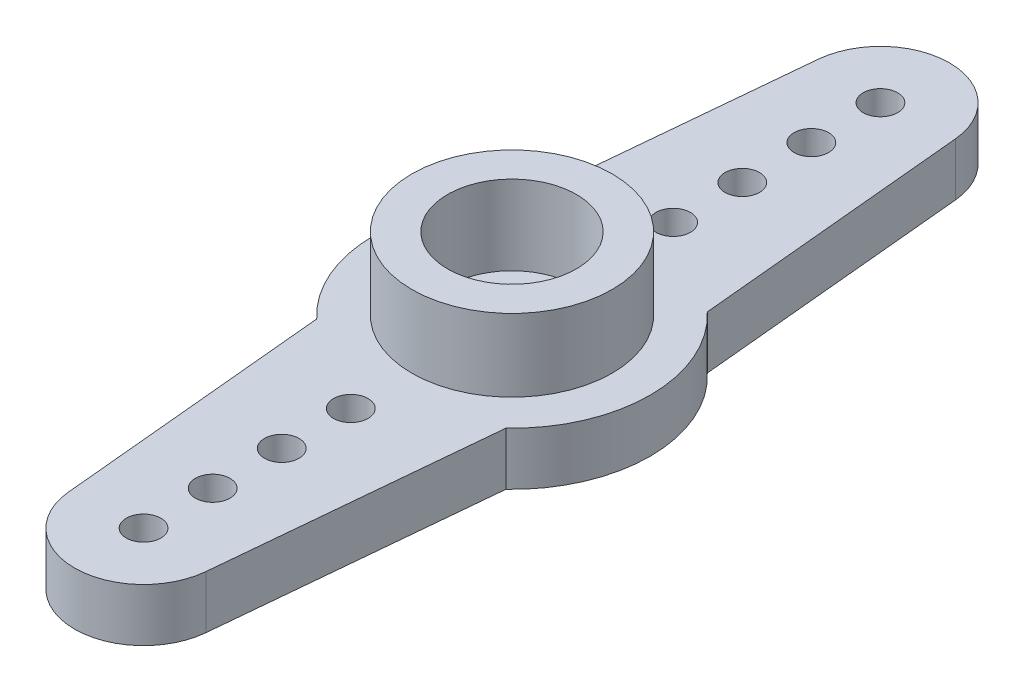
ISO-10303-21;
HEADER;
FILE_DESCRIPTION(('STEP AP214'),'2;1');
FILE_NAME('part.step','',(''),(''),'','','');
FILE_SCHEMA(('AUTOMOTIVE_DESIGN { 1 0 10303 214 1 1 1 1 }'));
ENDSEC;
DATA;
#1=APPLICATION_CONTEXT('core data for automotive mechanical design processes');
#2=APPLICATION_PROTOCOL_DEFINITION('international standard','automotive_design',2000,#1);
#3=PRODUCT_CONTEXT('',#1,'mechanical');
#4=PRODUCT('Part','Part','',(#3));
#5=PRODUCT_RELATED_PRODUCT_CATEGORY('part','',(#4));
#6=PRODUCT_DEFINITION_FORMATION('','',#4);
#7=PRODUCT_DEFINITION_CONTEXT('part definition',#1,'design');
#8=PRODUCT_DEFINITION('design','',#6,#7);
#9=PRODUCT_DEFINITION_SHAPE('','',#8);
#10=(LENGTH_UNIT() NAMED_UNIT(*) SI_UNIT(.MILLI.,.METRE.));
#11=(NAMED_UNIT(*) PLANE_ANGLE_UNIT() SI_UNIT($,.RADIAN.));
#12=(NAMED_UNIT(*) SI_UNIT($,.STERADIAN.) SOLID_ANGLE_UNIT());
#13=UNCERTAINTY_MEASURE_WITH_UNIT(LENGTH_MEASURE(1.E-05),#10,'distance_accuracy_value','');
#14=(GEOMETRIC_REPRESENTATION_CONTEXT(3) GLOBAL_UNCERTAINTY_ASSIGNED_CONTEXT((#13)) GLOBAL_UNIT_ASSIGNED_CONTEXT((#10,
#11,#12)) REPRESENTATION_CONTEXT('',''));
#15=CARTESIAN_POINT('',(0.,0.,0.));
#16=DIRECTION('',(0.,0.,1.));
#17=DIRECTION('',(1.,0.,0.));
#18=AXIS2_PLACEMENT_3D('',#15,#16,#17);
#19=CARTESIAN_POINT('',(0.,5.451,-13.));
#20=DIRECTION('',(0.,-1.,0.));
#21=DIRECTION('',(0.,0.,-1.));
#22=AXIS2_PLACEMENT_3D('',#19,#20,#21);
#23=CYLINDRICAL_SURFACE('',#22,0.75);
#24=CARTESIAN_POINT('',(0.,2.3,-13.));
#25=DIRECTION('',(0.,1.,0.));
#26=DIRECTION('',(0.,0.,1.));
#27=AXIS2_PLACEMENT_3D('',#24,#25,#26);
#28=CIRCLE('',#27,0.75);
#29=CARTESIAN_POINT('',(0.,2.3,-12.25));
#30=VERTEX_POINT('',#29);
#31=EDGE_CURVE('E176',#30,#30,#28,.T.);
#32=ORIENTED_EDGE('',*,*,#31,.T.);
#33=EDGE_LOOP('',(#32));
#34=FACE_BOUND('',#33,.T.);
#35=CARTESIAN_POINT('',(0.,0.,-13.));
#36=DIRECTION('',(0.,1.,0.));
#37=DIRECTION('',(0.,0.,1.));
#38=AXIS2_PLACEMENT_3D('',#35,#36,#37);
#39=CIRCLE('',#38,0.75);
#40=CARTESIAN_POINT('',(0.,0.,-12.25));
#41=VERTEX_POINT('',#40);
#42=EDGE_CURVE('E47',#41,#41,#39,.T.);
#43=ORIENTED_EDGE('',*,*,#42,.F.);
#44=EDGE_LOOP('',(#43));
#45=FACE_BOUND('',#44,.T.);
#46=ADVANCED_FACE('F39',(#34,#45),#23,.F.);
#47=CARTESIAN_POINT('',(0.,5.45,0.));
#48=DIRECTION('',(0.,1.,0.));
#49=DIRECTION('',(0.,0.,1.));
#50=AXIS2_PLACEMENT_3D('',#47,#48,#49);
#51=PLANE('',#50);
#52=CARTESIAN_POINT('',(0.,5.45,0.));
#53=DIRECTION('',(0.,1.,0.));
#54=DIRECTION('',(0.,0.,1.));
#55=AXIS2_PLACEMENT_3D('',#52,#53,#54);
#56=CIRCLE('',#55,4.35);
#57=CARTESIAN_POINT('',(0.,5.45,4.35));
#58=VERTEX_POINT('',#57);
#59=EDGE_CURVE('E173',#58,#58,#56,.T.);
#60=ORIENTED_EDGE('',*,*,#59,.T.);
#61=EDGE_LOOP('',(#60));
#62=FACE_BOUND('',#61,.T.);
#63=CARTESIAN_POINT('',(0.,5.45,0.));
#64=DIRECTION('',(0.,1.,0.));
#65=DIRECTION('',(0.,0.,1.));
#66=AXIS2_PLACEMENT_3D('',#63,#64,#65);
#67=CIRCLE('',#66,2.8);
#68=CARTESIAN_POINT('',(0.,5.45,2.8));
#69=VERTEX_POINT('',#68);
#70=EDGE_CURVE('E170',#69,#69,#67,.T.);
#71=ORIENTED_EDGE('',*,*,#70,.F.);
#72=EDGE_LOOP('',(#71));
#73=FACE_BOUND('',#72,.T.);
#74=ADVANCED_FACE('F185',(#62,#73),#51,.T.);
#75=CARTESIAN_POINT('',(0.,0.,0.));
#76=DIRECTION('',(0.,1.,0.));
#77=DIRECTION('',(0.,0.,1.));
#78=AXIS2_PLACEMENT_3D('',#75,#76,#77);
#79=PLANE('',#78);
#80=CARTESIAN_POINT('',(0.,0.,7.));
#81=DIRECTION('',(0.,-1.,0.));
#82=DIRECTION('',(0.,0.,-1.));
#83=AXIS2_PLACEMENT_3D('',#80,#81,#82);
#84=CIRCLE('',#83,0.75);
#85=CARTESIAN_POINT('',(0.,0.,6.25));
#86=VERTEX_POINT('',#85);
#87=EDGE_CURVE('E357',#86,#86,#84,.T.);
#88=ORIENTED_EDGE('',*,*,#87,.F.);
#89=EDGE_LOOP('',(#88));
#90=FACE_BOUND('',#89,.T.);
#91=CARTESIAN_POINT('',(0.,0.,10.));
#92=DIRECTION('',(0.,-1.,0.));
#93=DIRECTION('',(0.,0.,-1.));
#94=AXIS2_PLACEMENT_3D('',#91,#92,#93);
#95=CIRCLE('',#94,0.75);
#96=CARTESIAN_POINT('',(0.,0.,9.25));
#97=VERTEX_POINT('',#96);
#98=EDGE_CURVE('E374',#97,#97,#95,.T.);
#99=ORIENTED_EDGE('',*,*,#98,.F.);
#100=EDGE_LOOP('',(#99));
#101=FACE_BOUND('',#100,.T.);
#102=CARTESIAN_POINT('',(0.,0.,13.));
#103=DIRECTION('',(0.,-1.,0.));
#104=DIRECTION('',(0.,0.,-1.));
#105=AXIS2_PLACEMENT_3D('',#102,#103,#104);
#106=CIRCLE('',#105,0.75);
#107=CARTESIAN_POINT('',(0.,0.,12.25));
#108=VERTEX_POINT('',#107);
#109=EDGE_CURVE('E368',#108,#108,#106,.T.);
#110=ORIENTED_EDGE('',*,*,#109,.F.);
#111=EDGE_LOOP('',(#110));
#112=FACE_BOUND('',#111,.T.);
#113=CARTESIAN_POINT('',(0.,0.,16.));
#114=DIRECTION('',(0.,-1.,0.));
#115=DIRECTION('',(0.,0.,-1.));
#116=AXIS2_PLACEMENT_3D('',#113,#114,#115);
#117=CIRCLE('',#116,0.75);
#118=CARTESIAN_POINT('',(0.,0.,15.25));
#119=VERTEX_POINT('',#118);
#120=EDGE_CURVE('E361',#119,#119,#117,.T.);
#121=ORIENTED_EDGE('',*,*,#120,.F.);
#122=EDGE_LOOP('',(#121));
#123=FACE_BOUND('',#122,.T.);
#124=CARTESIAN_POINT('',(0.,0.,-16.));
#125=DIRECTION('',(0.,1.,0.));
#126=DIRECTION('',(0.,0.,1.));
#127=AXIS2_PLACEMENT_3D('',#124,#125,#126);
#128=CIRCLE('',#127,0.75);
#129=CARTESIAN_POINT('',(0.,0.,-15.25));
#130=VERTEX_POINT('',#129);
#131=EDGE_CURVE('E354',#130,#130,#128,.T.);
#132=ORIENTED_EDGE('',*,*,#131,.T.);
#133=EDGE_LOOP('',(#132));
#134=FACE_BOUND('',#133,.T.);
#135=CARTESIAN_POINT('',(0.,0.,-10.));
#136=DIRECTION('',(0.,1.,0.));
#137=DIRECTION('',(0.,0.,1.));
#138=AXIS2_PLACEMENT_3D('',#135,#136,#137);
#139=CIRCLE('',#138,0.75);
#140=CARTESIAN_POINT('',(0.,0.,-9.25));
#141=VERTEX_POINT('',#140);
#142=EDGE_CURVE('E319',#141,#141,#139,.T.);
#143=ORIENTED_EDGE('',*,*,#142,.T.);
#144=EDGE_LOOP('',(#143));
#145=FACE_BOUND('',#144,.T.);
#146=CARTESIAN_POINT('',(0.,0.,-7.));
#147=DIRECTION('',(0.,1.,0.));
#148=DIRECTION('',(0.,0.,1.));
#149=AXIS2_PLACEMENT_3D('',#146,#147,#148);
#150=CIRCLE('',#149,0.75);
#151=CARTESIAN_POINT('',(0.,0.,-6.25));
#152=VERTEX_POINT('',#151);
#153=EDGE_CURVE('E321',#152,#152,#150,.T.);
#154=ORIENTED_EDGE('',*,*,#153,.T.);
#155=EDGE_LOOP('',(#154));
#156=FACE_BOUND('',#155,.T.);
#157=DIRECTION('',(0.09375,0.,-0.995595770129625));
#158=VECTOR('',#157,1.);
#159=CARTESIAN_POINT('',(4.48018096558331,0.,0.421875));
#160=LINE('',#159,#158);
#161=CARTESIAN_POINT('',(2.98678731038887,0.,16.28125));
#162=VERTEX_POINT('',#161);
#163=CARTESIAN_POINT('',(4.10812218746485,0.,4.37302322116622));
#164=VERTEX_POINT('',#163);
#165=EDGE_CURVE('E137',#162,#164,#160,.T.);
#166=ORIENTED_EDGE('',*,*,#165,.F.);
#167=CARTESIAN_POINT('',(0.,0.,16.));
#168=DIRECTION('',(0.,1.,0.));
#169=DIRECTION('',(0.,0.,1.));
#170=AXIS2_PLACEMENT_3D('',#167,#168,#169);
#171=CIRCLE('',#170,3.);
#172=CARTESIAN_POINT('',(-2.98678731038887,0.,16.28125));
#173=VERTEX_POINT('',#172);
#174=EDGE_CURVE('E90',#173,#162,#171,.T.);
#175=ORIENTED_EDGE('',*,*,#174,.F.);
#176=DIRECTION('',(0.09375,0.,0.995595770129625));
#177=VECTOR('',#176,1.);
#178=CARTESIAN_POINT('',(-4.48018096558331,0.,0.421875));
#179=LINE('',#178,#177);
#180=CARTESIAN_POINT('',(-4.10812218746485,0.,4.37302322116622));
#181=VERTEX_POINT('',#180);
#182=EDGE_CURVE('E84',#181,#173,#179,.T.);
#183=ORIENTED_EDGE('',*,*,#182,.F.);
#184=CARTESIAN_POINT('',(0.,0.,0.));
#185=DIRECTION('',(0.,1.,0.));
#186=DIRECTION('',(0.,0.,1.));
#187=AXIS2_PLACEMENT_3D('',#184,#185,#186);
#188=CIRCLE('',#187,6.);
#189=CARTESIAN_POINT('',(-4.10812218746485,0.,-4.37302322116622));
#190=VERTEX_POINT('',#189);
#191=EDGE_CURVE('E127',#190,#181,#188,.T.);
#192=ORIENTED_EDGE('',*,*,#191,.F.);
#193=DIRECTION('',(-0.0937499999999999,0.,0.995595770129625));
#194=VECTOR('',#193,1.);
#195=CARTESIAN_POINT('',(-4.48018096558331,0.,-0.421875));
#196=LINE('',#195,#194);
#197=CARTESIAN_POINT('',(-2.98678731038887,0.,-16.28125));
#198=VERTEX_POINT('',#197);
#199=EDGE_CURVE('E147',#198,#190,#196,.T.);
#200=ORIENTED_EDGE('',*,*,#199,.F.);
#201=CARTESIAN_POINT('',(0.,0.,-16.));
#202=DIRECTION('',(0.,1.,0.));
#203=DIRECTION('',(0.,0.,1.));
#204=AXIS2_PLACEMENT_3D('',#201,#202,#203);
#205=CIRCLE('',#204,3.);
#206=CARTESIAN_POINT('',(2.98678731038888,0.,-16.28125));
#207=VERTEX_POINT('',#206);
#208=EDGE_CURVE('E145',#207,#198,#205,.T.);
#209=ORIENTED_EDGE('',*,*,#208,.F.);
#210=DIRECTION('',(-0.0937499999999999,0.,-0.995595770129625));
#211=VECTOR('',#210,1.);
#212=CARTESIAN_POINT('',(4.48018096558331,0.,-0.421874999999999));
#213=LINE('',#212,#211);
#214=CARTESIAN_POINT('',(4.10812218746485,0.,-4.37302322116622));
#215=VERTEX_POINT('',#214);
#216=EDGE_CURVE('E143',#215,#207,#213,.T.);
#217=ORIENTED_EDGE('',*,*,#216,.F.);
#218=CARTESIAN_POINT('',(0.,0.,0.));
#219=DIRECTION('',(0.,1.,0.));
#220=DIRECTION('',(0.,0.,1.));
#221=AXIS2_PLACEMENT_3D('',#218,#219,#220);
#222=CIRCLE('',#221,6.);
#223=EDGE_CURVE('E140',#164,#215,#222,.T.);
#224=ORIENTED_EDGE('',*,*,#223,.F.);
#225=EDGE_LOOP('',(#166,#175,#183,#192,#200,#209,#217,#224));
#226=FACE_BOUND('',#225,.T.);
#227=ORIENTED_EDGE('',*,*,#42,.T.);
#228=EDGE_LOOP('',(#227));
#229=FACE_BOUND('',#228,.T.);
#230=CARTESIAN_POINT('',(0.,0.,0.));
#231=DIRECTION('',(0.,1.,0.));
#232=DIRECTION('',(0.,0.,1.));
#233=AXIS2_PLACEMENT_3D('',#230,#231,#232);
#234=CIRCLE('',#233,1.5);
#235=CARTESIAN_POINT('',(0.,0.,1.5));
#236=VERTEX_POINT('',#235);
#237=EDGE_CURVE('E381',#236,#236,#234,.T.);
#238=ORIENTED_EDGE('',*,*,#237,.T.);
#239=EDGE_LOOP('',(#238));
#240=FACE_BOUND('',#239,.T.);
#241=ADVANCED_FACE('F181',(#90,#101,#112,#123,#134,#145,#156,#226,#229,#240),#79,.F.);
#242=CARTESIAN_POINT('',(0.,5.45,0.));
#243=DIRECTION('',(0.,-1.,0.));
#244=DIRECTION('',(0.,0.,-1.));
#245=AXIS2_PLACEMENT_3D('',#242,#243,#244);
#246=CYLINDRICAL_SURFACE('',#245,4.35);
#247=CARTESIAN_POINT('',(0.,2.3,0.));
#248=DIRECTION('',(0.,1.,0.));
#249=DIRECTION('',(0.,0.,1.));
#250=AXIS2_PLACEMENT_3D('',#247,#248,#249);
#251=CIRCLE('',#250,4.35);
#252=CARTESIAN_POINT('',(0.,2.3,4.35));
#253=VERTEX_POINT('',#252);
#254=EDGE_CURVE('E167',#253,#253,#251,.T.);
#255=ORIENTED_EDGE('',*,*,#254,.T.);
#256=EDGE_LOOP('',(#255));
#257=FACE_BOUND('',#256,.T.);
#258=ORIENTED_EDGE('',*,*,#59,.F.);
#259=EDGE_LOOP('',(#258));
#260=FACE_BOUND('',#259,.T.);
#261=ADVANCED_FACE('F206',(#257,#260),#246,.T.);
#262=CARTESIAN_POINT('',(0.,5.45,0.));
#263=DIRECTION('',(0.,-1.,0.));
#264=DIRECTION('',(0.,0.,-1.));
#265=AXIS2_PLACEMENT_3D('',#262,#263,#264);
#266=CYLINDRICAL_SURFACE('',#265,2.8);
#267=CARTESIAN_POINT('',(0.,2.,0.));
#268=DIRECTION('',(0.,1.,0.));
#269=DIRECTION('',(0.,0.,1.));
#270=AXIS2_PLACEMENT_3D('',#267,#268,#269);
#271=CIRCLE('',#270,2.8);
#272=CARTESIAN_POINT('',(0.,2.,2.8));
#273=VERTEX_POINT('',#272);
#274=EDGE_CURVE('E11',#273,#273,#271,.T.);
#275=ORIENTED_EDGE('',*,*,#274,.F.);
#276=EDGE_LOOP('',(#275));
#277=FACE_BOUND('',#276,.T.);
#278=ORIENTED_EDGE('',*,*,#70,.T.);
#279=EDGE_LOOP('',(#278));
#280=FACE_BOUND('',#279,.T.);
#281=ADVANCED_FACE('F196',(#277,#280),#266,.F.);
#282=CARTESIAN_POINT('',(0.,2.3,0.));
#283=DIRECTION('',(0.,1.,0.));
#284=DIRECTION('',(0.,0.,1.));
#285=AXIS2_PLACEMENT_3D('',#282,#283,#284);
#286=PLANE('',#285);
#287=CARTESIAN_POINT('',(0.,2.3,7.));
#288=DIRECTION('',(0.,1.,0.));
#289=DIRECTION('',(0.,0.,1.));
#290=AXIS2_PLACEMENT_3D('',#287,#288,#289);
#291=CIRCLE('',#290,0.75);
#292=CARTESIAN_POINT('',(0.,2.3,7.75));
#293=VERTEX_POINT('',#292);
#294=EDGE_CURVE('E377',#293,#293,#291,.F.);
#295=ORIENTED_EDGE('',*,*,#294,.T.);
#296=EDGE_LOOP('',(#295));
#297=FACE_BOUND('',#296,.T.);
#298=CARTESIAN_POINT('',(0.,2.3,10.));
#299=DIRECTION('',(0.,1.,0.));
#300=DIRECTION('',(0.,0.,1.));
#301=AXIS2_PLACEMENT_3D('',#298,#299,#300);
#302=CIRCLE('',#301,0.75);
#303=CARTESIAN_POINT('',(0.,2.3,10.75));
#304=VERTEX_POINT('',#303);
#305=EDGE_CURVE('E371',#304,#304,#302,.F.);
#306=ORIENTED_EDGE('',*,*,#305,.T.);
#307=EDGE_LOOP('',(#306));
#308=FACE_BOUND('',#307,.T.);
#309=CARTESIAN_POINT('',(0.,2.3,13.));
#310=DIRECTION('',(0.,1.,0.));
#311=DIRECTION('',(0.,0.,1.));
#312=AXIS2_PLACEMENT_3D('',#309,#310,#311);
#313=CIRCLE('',#312,0.75);
#314=CARTESIAN_POINT('',(0.,2.3,13.75));
#315=VERTEX_POINT('',#314);
#316=EDGE_CURVE('E365',#315,#315,#313,.F.);
#317=ORIENTED_EDGE('',*,*,#316,.T.);
#318=EDGE_LOOP('',(#317));
#319=FACE_BOUND('',#318,.T.);
#320=CARTESIAN_POINT('',(0.,2.3,16.));
#321=DIRECTION('',(0.,1.,0.));
#322=DIRECTION('',(0.,0.,1.));
#323=AXIS2_PLACEMENT_3D('',#320,#321,#322);
#324=CIRCLE('',#323,0.75);
#325=CARTESIAN_POINT('',(0.,2.3,16.75));
#326=VERTEX_POINT('',#325);
#327=EDGE_CURVE('E358',#326,#326,#324,.F.);
#328=ORIENTED_EDGE('',*,*,#327,.T.);
#329=EDGE_LOOP('',(#328));
#330=FACE_BOUND('',#329,.T.);
#331=CARTESIAN_POINT('',(0.,2.3,-16.));
#332=DIRECTION('',(0.,1.,0.));
#333=DIRECTION('',(0.,0.,1.));
#334=AXIS2_PLACEMENT_3D('',#331,#332,#333);
#335=CIRCLE('',#334,0.75);
#336=CARTESIAN_POINT('',(0.,2.3,-15.25));
#337=VERTEX_POINT('',#336);
#338=EDGE_CURVE('E325',#337,#337,#335,.T.);
#339=ORIENTED_EDGE('',*,*,#338,.F.);
#340=EDGE_LOOP('',(#339));
#341=FACE_BOUND('',#340,.T.);
#342=CARTESIAN_POINT('',(0.,2.3,-10.));
#343=DIRECTION('',(0.,1.,0.));
#344=DIRECTION('',(0.,0.,1.));
#345=AXIS2_PLACEMENT_3D('',#342,#343,#344);
#346=CIRCLE('',#345,0.75);
#347=CARTESIAN_POINT('',(0.,2.3,-9.25));
#348=VERTEX_POINT('',#347);
#349=EDGE_CURVE('E316',#348,#348,#346,.T.);
#350=ORIENTED_EDGE('',*,*,#349,.F.);
#351=EDGE_LOOP('',(#350));
#352=FACE_BOUND('',#351,.T.);
#353=CARTESIAN_POINT('',(0.,2.3,-7.));
#354=DIRECTION('',(0.,1.,0.));
#355=DIRECTION('',(0.,0.,1.));
#356=AXIS2_PLACEMENT_3D('',#353,#354,#355);
#357=CIRCLE('',#356,0.75);
#358=CARTESIAN_POINT('',(0.,2.3,-6.25));
#359=VERTEX_POINT('',#358);
#360=EDGE_CURVE('E141',#359,#359,#357,.T.);
#361=ORIENTED_EDGE('',*,*,#360,.F.);
#362=EDGE_LOOP('',(#361));
#363=FACE_BOUND('',#362,.T.);
#364=DIRECTION('',(0.09375,0.,-0.995595770129625));
#365=VECTOR('',#364,1.);
#366=CARTESIAN_POINT('',(4.48018096558331,2.3,0.421875));
#367=LINE('',#366,#365);
#368=CARTESIAN_POINT('',(2.98678731038887,2.3,16.28125));
#369=VERTEX_POINT('',#368);
#370=CARTESIAN_POINT('',(4.10812218746485,2.3,4.37302322116622));
#371=VERTEX_POINT('',#370);
#372=EDGE_CURVE('E152',#369,#371,#367,.T.);
#373=ORIENTED_EDGE('',*,*,#372,.T.);
#374=CARTESIAN_POINT('',(0.,2.3,0.));
#375=DIRECTION('',(0.,1.,0.));
#376=DIRECTION('',(0.,0.,1.));
#377=AXIS2_PLACEMENT_3D('',#374,#375,#376);
#378=CIRCLE('',#377,6.);
#379=CARTESIAN_POINT('',(4.10812218746485,2.3,-4.37302322116622));
#380=VERTEX_POINT('',#379);
#381=EDGE_CURVE('E99',#371,#380,#378,.T.);
#382=ORIENTED_EDGE('',*,*,#381,.T.);
#383=DIRECTION('',(-0.0937499999999999,0.,-0.995595770129625));
#384=VECTOR('',#383,1.);
#385=CARTESIAN_POINT('',(4.48018096558331,2.3,-0.421874999999999));
#386=LINE('',#385,#384);
#387=CARTESIAN_POINT('',(2.98678731038888,2.3,-16.28125));
#388=VERTEX_POINT('',#387);
#389=EDGE_CURVE('E333',#380,#388,#386,.T.);
#390=ORIENTED_EDGE('',*,*,#389,.T.);
#391=CARTESIAN_POINT('',(0.,2.3,-16.));
#392=DIRECTION('',(0.,1.,0.));
#393=DIRECTION('',(0.,0.,1.));
#394=AXIS2_PLACEMENT_3D('',#391,#392,#393);
#395=CIRCLE('',#394,3.);
#396=CARTESIAN_POINT('',(-2.98678731038887,2.3,-16.28125));
#397=VERTEX_POINT('',#396);
#398=EDGE_CURVE('E335',#388,#397,#395,.T.);
#399=ORIENTED_EDGE('',*,*,#398,.T.);
#400=DIRECTION('',(-0.0937499999999999,0.,0.995595770129625));
#401=VECTOR('',#400,1.);
#402=CARTESIAN_POINT('',(-4.48018096558331,2.3,-0.421875));
#403=LINE('',#402,#401);
#404=CARTESIAN_POINT('',(-4.10812218746485,2.3,-4.37302322116622));
#405=VERTEX_POINT('',#404);
#406=EDGE_CURVE('E119',#397,#405,#403,.T.);
#407=ORIENTED_EDGE('',*,*,#406,.T.);
#408=CARTESIAN_POINT('',(0.,2.3,0.));
#409=DIRECTION('',(0.,1.,0.));
#410=DIRECTION('',(0.,0.,1.));
#411=AXIS2_PLACEMENT_3D('',#408,#409,#410);
#412=CIRCLE('',#411,6.);
#413=CARTESIAN_POINT('',(-4.10812218746485,2.3,4.37302322116622));
#414=VERTEX_POINT('',#413);
#415=EDGE_CURVE('E112',#405,#414,#412,.T.);
#416=ORIENTED_EDGE('',*,*,#415,.T.);
#417=DIRECTION('',(0.09375,0.,0.995595770129625));
#418=VECTOR('',#417,1.);
#419=CARTESIAN_POINT('',(-4.48018096558331,2.3,0.421875));
#420=LINE('',#419,#418);
#421=CARTESIAN_POINT('',(-2.98678731038887,2.3,16.28125));
#422=VERTEX_POINT('',#421);
#423=EDGE_CURVE('E117',#414,#422,#420,.T.);
#424=ORIENTED_EDGE('',*,*,#423,.T.);
#425=CARTESIAN_POINT('',(0.,2.3,16.));
#426=DIRECTION('',(0.,1.,0.));
#427=DIRECTION('',(0.,0.,1.));
#428=AXIS2_PLACEMENT_3D('',#425,#426,#427);
#429=CIRCLE('',#428,3.);
#430=EDGE_CURVE('E55',#422,#369,#429,.T.);
#431=ORIENTED_EDGE('',*,*,#430,.T.);
#432=EDGE_LOOP('',(#373,#382,#390,#399,#407,#416,#424,#431));
#433=FACE_BOUND('',#432,.T.);
#434=ORIENTED_EDGE('',*,*,#254,.F.);
#435=EDGE_LOOP('',(#434));
#436=FACE_BOUND('',#435,.T.);
#437=ORIENTED_EDGE('',*,*,#31,.F.);
#438=EDGE_LOOP('',(#437));
#439=FACE_BOUND('',#438,.T.);
#440=ADVANCED_FACE('F114',(#297,#308,#319,#330,#341,#352,#363,#433,#436,#439),#286,.T.);
#441=CARTESIAN_POINT('',(4.48018096558331,2.3,0.421875));
#442=DIRECTION('',(-0.995595770129624,0.,-0.09375));
#443=DIRECTION('',(-0.09375,0.,0.995595770129625));
#444=AXIS2_PLACEMENT_3D('',#441,#442,#443);
#445=PLANE('',#444);
#446=ORIENTED_EDGE('',*,*,#165,.T.);
#447=DIRECTION('',(0.,-1.,0.));
#448=VECTOR('',#447,1.);
#449=CARTESIAN_POINT('',(4.10812218746485,2.3,4.37302322116622));
#450=LINE('',#449,#448);
#451=EDGE_CURVE('E165',#371,#164,#450,.T.);
#452=ORIENTED_EDGE('',*,*,#451,.F.);
#453=ORIENTED_EDGE('',*,*,#372,.F.);
#454=DIRECTION('',(0.,-1.,0.));
#455=VECTOR('',#454,1.);
#456=CARTESIAN_POINT('',(2.98678731038887,2.3,16.28125));
#457=LINE('',#456,#455);
#458=EDGE_CURVE('E133',#369,#162,#457,.T.);
#459=ORIENTED_EDGE('',*,*,#458,.T.);
#460=EDGE_LOOP('',(#446,#452,#453,#459));
#461=FACE_BOUND('',#460,.T.);
#462=ADVANCED_FACE('F195',(#461),#445,.F.);
#463=CARTESIAN_POINT('',(0.,2.3,0.));
#464=DIRECTION('',(0.,-1.,0.));
#465=DIRECTION('',(0.,0.,-1.));
#466=AXIS2_PLACEMENT_3D('',#463,#464,#465);
#467=CYLINDRICAL_SURFACE('',#466,6.);
#468=ORIENTED_EDGE('',*,*,#223,.T.);
#469=DIRECTION('',(0.,-1.,0.));
#470=VECTOR('',#469,1.);
#471=CARTESIAN_POINT('',(4.10812218746485,2.3,-4.37302322116622));
#472=LINE('',#471,#470);
#473=EDGE_CURVE('E162',#380,#215,#472,.T.);
#474=ORIENTED_EDGE('',*,*,#473,.F.);
#475=ORIENTED_EDGE('',*,*,#381,.F.);
#476=ORIENTED_EDGE('',*,*,#451,.T.);
#477=EDGE_LOOP('',(#468,#474,#475,#476));
#478=FACE_BOUND('',#477,.T.);
#479=ADVANCED_FACE('F203',(#478),#467,.T.);
#480=CARTESIAN_POINT('',(4.48018096558331,2.3,-0.421874999999999));
#481=DIRECTION('',(-0.995595770129624,0.,0.0937499999999999));
#482=DIRECTION('',(0.0937499999999999,0.,0.995595770129625));
#483=AXIS2_PLACEMENT_3D('',#480,#481,#482);
#484=PLANE('',#483);
#485=ORIENTED_EDGE('',*,*,#216,.T.);
#486=DIRECTION('',(0.,-1.,0.));
#487=VECTOR('',#486,1.);
#488=CARTESIAN_POINT('',(2.98678731038888,2.3,-16.28125));
#489=LINE('',#488,#487);
#490=EDGE_CURVE('E159',#388,#207,#489,.T.);
#491=ORIENTED_EDGE('',*,*,#490,.F.);
#492=ORIENTED_EDGE('',*,*,#389,.F.);
#493=ORIENTED_EDGE('',*,*,#473,.T.);
#494=EDGE_LOOP('',(#485,#491,#492,#493));
#495=FACE_BOUND('',#494,.T.);
#496=ADVANCED_FACE('F229',(#495),#484,.F.);
#497=CARTESIAN_POINT('',(0.,2.3,-16.));
#498=DIRECTION('',(0.,-1.,0.));
#499=DIRECTION('',(0.,0.,-1.));
#500=AXIS2_PLACEMENT_3D('',#497,#498,#499);
#501=CYLINDRICAL_SURFACE('',#500,3.);
#502=ORIENTED_EDGE('',*,*,#208,.T.);
#503=DIRECTION('',(0.,-1.,0.));
#504=VECTOR('',#503,1.);
#505=CARTESIAN_POINT('',(-2.98678731038887,2.3,-16.28125));
#506=LINE('',#505,#504);
#507=EDGE_CURVE('E156',#397,#198,#506,.T.);
#508=ORIENTED_EDGE('',*,*,#507,.F.);
#509=ORIENTED_EDGE('',*,*,#398,.F.);
#510=ORIENTED_EDGE('',*,*,#490,.T.);
#511=EDGE_LOOP('',(#502,#508,#509,#510));
#512=FACE_BOUND('',#511,.T.);
#513=ADVANCED_FACE('F225',(#512),#501,.T.);
#514=CARTESIAN_POINT('',(-4.48018096558331,2.3,-0.421875));
#515=DIRECTION('',(0.995595770129624,0.,0.0937499999999999));
#516=DIRECTION('',(0.0937499999999999,0.,-0.995595770129625));
#517=AXIS2_PLACEMENT_3D('',#514,#515,#516);
#518=PLANE('',#517);
#519=ORIENTED_EDGE('',*,*,#199,.T.);
#520=DIRECTION('',(0.,-1.,0.));
#521=VECTOR('',#520,1.);
#522=CARTESIAN_POINT('',(-4.10812218746485,2.3,-4.37302322116622));
#523=LINE('',#522,#521);
#524=EDGE_CURVE('E128',#405,#190,#523,.T.);
#525=ORIENTED_EDGE('',*,*,#524,.F.);
#526=ORIENTED_EDGE('',*,*,#406,.F.);
#527=ORIENTED_EDGE('',*,*,#507,.T.);
#528=EDGE_LOOP('',(#519,#525,#526,#527));
#529=FACE_BOUND('',#528,.T.);
#530=ADVANCED_FACE('F222',(#529),#518,.F.);
#531=CARTESIAN_POINT('',(0.,2.3,0.));
#532=DIRECTION('',(0.,-1.,0.));
#533=DIRECTION('',(0.,0.,-1.));
#534=AXIS2_PLACEMENT_3D('',#531,#532,#533);
#535=CYLINDRICAL_SURFACE('',#534,6.);
#536=ORIENTED_EDGE('',*,*,#191,.T.);
#537=DIRECTION('',(0.,-1.,0.));
#538=VECTOR('',#537,1.);
#539=CARTESIAN_POINT('',(-4.10812218746485,2.3,4.37302322116622));
#540=LINE('',#539,#538);
#541=EDGE_CURVE('E124',#414,#181,#540,.T.);
#542=ORIENTED_EDGE('',*,*,#541,.F.);
#543=ORIENTED_EDGE('',*,*,#415,.F.);
#544=ORIENTED_EDGE('',*,*,#524,.T.);
#545=EDGE_LOOP('',(#536,#542,#543,#544));
#546=FACE_BOUND('',#545,.T.);
#547=ADVANCED_FACE('F125',(#546),#535,.T.);
#548=CARTESIAN_POINT('',(-4.48018096558331,2.3,0.421875));
#549=DIRECTION('',(0.995595770129624,0.,-0.09375));
#550=DIRECTION('',(-0.09375,0.,-0.995595770129625));
#551=AXIS2_PLACEMENT_3D('',#548,#549,#550);
#552=PLANE('',#551);
#553=ORIENTED_EDGE('',*,*,#182,.T.);
#554=DIRECTION('',(0.,-1.,0.));
#555=VECTOR('',#554,1.);
#556=CARTESIAN_POINT('',(-2.98678731038887,2.3,16.28125));
#557=LINE('',#556,#555);
#558=EDGE_CURVE('E129',#422,#173,#557,.T.);
#559=ORIENTED_EDGE('',*,*,#558,.F.);
#560=ORIENTED_EDGE('',*,*,#423,.F.);
#561=ORIENTED_EDGE('',*,*,#541,.T.);
#562=EDGE_LOOP('',(#553,#559,#560,#561));
#563=FACE_BOUND('',#562,.T.);
#564=ADVANCED_FACE('F131',(#563),#552,.F.);
#565=CARTESIAN_POINT('',(0.,2.3,16.));
#566=DIRECTION('',(0.,-1.,0.));
#567=DIRECTION('',(0.,0.,-1.));
#568=AXIS2_PLACEMENT_3D('',#565,#566,#567);
#569=CYLINDRICAL_SURFACE('',#568,3.);
#570=ORIENTED_EDGE('',*,*,#174,.T.);
#571=ORIENTED_EDGE('',*,*,#458,.F.);
#572=ORIENTED_EDGE('',*,*,#430,.F.);
#573=ORIENTED_EDGE('',*,*,#558,.T.);
#574=EDGE_LOOP('',(#570,#571,#572,#573));
#575=FACE_BOUND('',#574,.T.);
#576=ADVANCED_FACE('F215',(#575),#569,.T.);
#577=CARTESIAN_POINT('',(0.,5.451,-7.));
#578=DIRECTION('',(0.,-1.,0.));
#579=DIRECTION('',(0.,0.,-1.));
#580=AXIS2_PLACEMENT_3D('',#577,#578,#579);
#581=CYLINDRICAL_SURFACE('',#580,0.75);
#582=ORIENTED_EDGE('',*,*,#360,.T.);
#583=EDGE_LOOP('',(#582));
#584=FACE_BOUND('',#583,.T.);
#585=ORIENTED_EDGE('',*,*,#153,.F.);
#586=EDGE_LOOP('',(#585));
#587=FACE_BOUND('',#586,.T.);
#588=ADVANCED_FACE('F213',(#584,#587),#581,.F.);
#589=CARTESIAN_POINT('',(0.,5.451,-10.));
#590=DIRECTION('',(0.,-1.,0.));
#591=DIRECTION('',(0.,0.,-1.));
#592=AXIS2_PLACEMENT_3D('',#589,#590,#591);
#593=CYLINDRICAL_SURFACE('',#592,0.75);
#594=ORIENTED_EDGE('',*,*,#349,.T.);
#595=EDGE_LOOP('',(#594));
#596=FACE_BOUND('',#595,.T.);
#597=ORIENTED_EDGE('',*,*,#142,.F.);
#598=EDGE_LOOP('',(#597));
#599=FACE_BOUND('',#598,.T.);
#600=ADVANCED_FACE('F305',(#596,#599),#593,.F.);
#601=CARTESIAN_POINT('',(0.,5.451,-16.));
#602=DIRECTION('',(0.,-1.,0.));
#603=DIRECTION('',(0.,0.,-1.));
#604=AXIS2_PLACEMENT_3D('',#601,#602,#603);
#605=CYLINDRICAL_SURFACE('',#604,0.75);
#606=ORIENTED_EDGE('',*,*,#338,.T.);
#607=EDGE_LOOP('',(#606));
#608=FACE_BOUND('',#607,.T.);
#609=ORIENTED_EDGE('',*,*,#131,.F.);
#610=EDGE_LOOP('',(#609));
#611=FACE_BOUND('',#610,.T.);
#612=ADVANCED_FACE('F302',(#608,#611),#605,.F.);
#613=CARTESIAN_POINT('',(0.,5.451,16.));
#614=DIRECTION('',(0.,-1.,0.));
#615=DIRECTION('',(0.,0.,-1.));
#616=AXIS2_PLACEMENT_3D('',#613,#614,#615);
#617=CYLINDRICAL_SURFACE('',#616,0.75);
#618=ORIENTED_EDGE('',*,*,#327,.F.);
#619=EDGE_LOOP('',(#618));
#620=FACE_BOUND('',#619,.T.);
#621=ORIENTED_EDGE('',*,*,#120,.T.);
#622=EDGE_LOOP('',(#621));
#623=FACE_BOUND('',#622,.T.);
#624=ADVANCED_FACE('F298',(#620,#623),#617,.F.);
#625=CARTESIAN_POINT('',(0.,5.451,13.));
#626=DIRECTION('',(0.,-1.,0.));
#627=DIRECTION('',(0.,0.,-1.));
#628=AXIS2_PLACEMENT_3D('',#625,#626,#627);
#629=CYLINDRICAL_SURFACE('',#628,0.75);
#630=ORIENTED_EDGE('',*,*,#316,.F.);
#631=EDGE_LOOP('',(#630));
#632=FACE_BOUND('',#631,.T.);
#633=ORIENTED_EDGE('',*,*,#109,.T.);
#634=EDGE_LOOP('',(#633));
#635=FACE_BOUND('',#634,.T.);
#636=ADVANCED_FACE('F294',(#632,#635),#629,.F.);
#637=CARTESIAN_POINT('',(0.,5.451,10.));
#638=DIRECTION('',(0.,-1.,0.));
#639=DIRECTION('',(0.,0.,-1.));
#640=AXIS2_PLACEMENT_3D('',#637,#638,#639);
#641=CYLINDRICAL_SURFACE('',#640,0.75);
#642=ORIENTED_EDGE('',*,*,#305,.F.);
#643=EDGE_LOOP('',(#642));
#644=FACE_BOUND('',#643,.T.);
#645=ORIENTED_EDGE('',*,*,#98,.T.);
#646=EDGE_LOOP('',(#645));
#647=FACE_BOUND('',#646,.T.);
#648=ADVANCED_FACE('F290',(#644,#647),#641,.F.);
#649=CARTESIAN_POINT('',(0.,5.451,7.));
#650=DIRECTION('',(0.,-1.,0.));
#651=DIRECTION('',(0.,0.,-1.));
#652=AXIS2_PLACEMENT_3D('',#649,#650,#651);
#653=CYLINDRICAL_SURFACE('',#652,0.75);
#654=ORIENTED_EDGE('',*,*,#294,.F.);
#655=EDGE_LOOP('',(#654));
#656=FACE_BOUND('',#655,.T.);
#657=ORIENTED_EDGE('',*,*,#87,.T.);
#658=EDGE_LOOP('',(#657));
#659=FACE_BOUND('',#658,.T.);
#660=ADVANCED_FACE('F271',(#656,#659),#653,.F.);
#661=CARTESIAN_POINT('',(0.,2.,0.));
#662=DIRECTION('',(0.,1.,0.));
#663=DIRECTION('',(0.,0.,1.));
#664=AXIS2_PLACEMENT_3D('',#661,#662,#663);
#665=PLANE('',#664);
#666=ORIENTED_EDGE('',*,*,#274,.T.);
#667=EDGE_LOOP('',(#666));
#668=FACE_BOUND('',#667,.T.);
#669=CARTESIAN_POINT('',(0.,2.,0.));
#670=DIRECTION('',(0.,1.,0.));
#671=DIRECTION('',(0.,0.,1.));
#672=AXIS2_PLACEMENT_3D('',#669,#670,#671);
#673=CIRCLE('',#672,1.5);
#674=CARTESIAN_POINT('',(0.,2.,1.5));
#675=VERTEX_POINT('',#674);
#676=EDGE_CURVE('E362',#675,#675,#673,.T.);
#677=ORIENTED_EDGE('',*,*,#676,.F.);
#678=EDGE_LOOP('',(#677));
#679=FACE_BOUND('',#678,.T.);
#680=ADVANCED_FACE('F265',(#668,#679),#665,.T.);
#681=CARTESIAN_POINT('',(0.,2.,0.));
#682=DIRECTION('',(0.,-1.,0.));
#683=DIRECTION('',(0.,0.,-1.));
#684=AXIS2_PLACEMENT_3D('',#681,#682,#683);
#685=CYLINDRICAL_SURFACE('',#684,1.5);
#686=ORIENTED_EDGE('',*,*,#676,.T.);
#687=EDGE_LOOP('',(#686));
#688=FACE_BOUND('',#687,.T.);
#689=ORIENTED_EDGE('',*,*,#237,.F.);
#690=EDGE_LOOP('',(#689));
#691=FACE_BOUND('',#690,.T.);
#692=ADVANCED_FACE('F270',(#688,#691),#685,.F.);
#693=CLOSED_SHELL('',(#46,#74,#241,#261,#281,#440,#462,#479,#496,#513,#530,#547,#564,#576,#588,
#600,#612,#624,#636,#648,#660,#680,#692));
#694=MANIFOLD_SOLID_BREP('B2',#693);
#695=ADVANCED_BREP_SHAPE_REPRESENTATION('',(#18,#694),#14);
#696=SHAPE_DEFINITION_REPRESENTATION(#9,#695);
ENDSEC;
END-ISO-10303-21;
